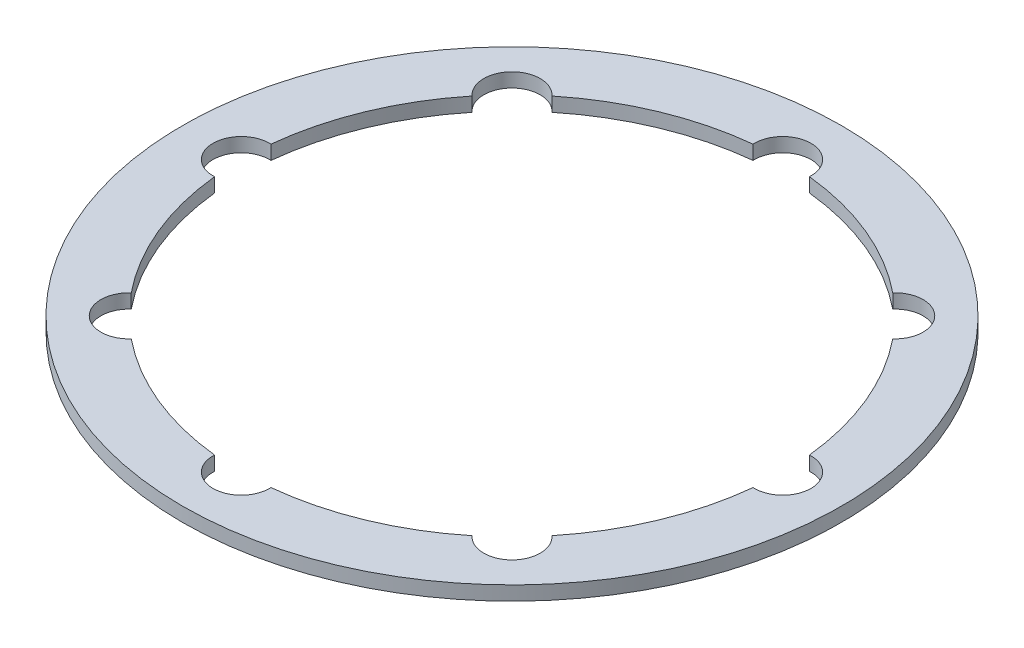
ISO-10303-21;
HEADER;
FILE_DESCRIPTION(('STEP AP214'),'2;1');
FILE_NAME('part.step','',(''),(''),'','','');
FILE_SCHEMA(('AUTOMOTIVE_DESIGN { 1 0 10303 214 1 1 1 1 }'));
ENDSEC;
DATA;
#1=APPLICATION_CONTEXT('core data for automotive mechanical design processes');
#2=APPLICATION_PROTOCOL_DEFINITION('international standard','automotive_design',2000,#1);
#3=PRODUCT_CONTEXT('',#1,'mechanical');
#4=PRODUCT('Part','Part','',(#3));
#5=PRODUCT_RELATED_PRODUCT_CATEGORY('part','',(#4));
#6=PRODUCT_DEFINITION_FORMATION('','',#4);
#7=PRODUCT_DEFINITION_CONTEXT('part definition',#1,'design');
#8=PRODUCT_DEFINITION('design','',#6,#7);
#9=PRODUCT_DEFINITION_SHAPE('','',#8);
#10=(LENGTH_UNIT() NAMED_UNIT(*) SI_UNIT(.MILLI.,.METRE.));
#11=(NAMED_UNIT(*) PLANE_ANGLE_UNIT() SI_UNIT($,.RADIAN.));
#12=(NAMED_UNIT(*) SI_UNIT($,.STERADIAN.) SOLID_ANGLE_UNIT());
#13=UNCERTAINTY_MEASURE_WITH_UNIT(LENGTH_MEASURE(1.E-05),#10,'distance_accuracy_value','');
#14=(GEOMETRIC_REPRESENTATION_CONTEXT(3) GLOBAL_UNCERTAINTY_ASSIGNED_CONTEXT((#13)) GLOBAL_UNIT_ASSIGNED_CONTEXT((#10,
#11,#12)) REPRESENTATION_CONTEXT('',''));
#15=CARTESIAN_POINT('',(0.,0.,0.));
#16=DIRECTION('',(0.,0.,1.));
#17=DIRECTION('',(1.,0.,0.));
#18=AXIS2_PLACEMENT_3D('',#15,#16,#17);
#19=CARTESIAN_POINT('',(0.,3.,0.));
#20=DIRECTION('',(0.,1.,0.));
#21=DIRECTION('',(0.,0.,1.));
#22=AXIS2_PLACEMENT_3D('',#19,#20,#21);
#23=PLANE('',#22);
#24=CARTESIAN_POINT('',(0.,3.,0.));
#25=DIRECTION('',(0.,1.,0.));
#26=DIRECTION('',(0.,0.,1.));
#27=AXIS2_PLACEMENT_3D('',#24,#25,#26);
#28=CIRCLE('',#27,70.);
#29=CARTESIAN_POINT('',(0.,3.,70.));
#30=VERTEX_POINT('',#29);
#31=EDGE_CURVE('E11',#30,#30,#28,.T.);
#32=ORIENTED_EDGE('',*,*,#31,.T.);
#33=EDGE_LOOP('',(#32));
#34=FACE_BOUND('',#33,.T.);
#35=CARTESIAN_POINT('',(1.32902621308496E-12,3.,-57.4999999999966));
#36=DIRECTION('',(0.,1.,0.));
#37=DIRECTION('',(0.,0.,1.));
#38=AXIS2_PLACEMENT_3D('',#35,#36,#37);
#39=CIRCLE('',#38,5.99999999999979);
#40=CARTESIAN_POINT('',(5.99182808337604,3.,-57.186956521739));
#41=VERTEX_POINT('',#40);
#42=CARTESIAN_POINT('',(-5.99182808337409,3.,-57.1869565217392));
#43=VERTEX_POINT('',#42);
#44=EDGE_CURVE('E162',#41,#43,#39,.T.);
#45=ORIENTED_EDGE('',*,*,#44,.F.);
#46=CARTESIAN_POINT('',(0.,3.,0.));
#47=DIRECTION('',(0.,1.,0.));
#48=DIRECTION('',(0.,0.,1.));
#49=AXIS2_PLACEMENT_3D('',#46,#47,#48);
#50=CIRCLE('',#49,57.5);
#51=CARTESIAN_POINT('',(36.2004224824845,3.,-44.6741470213996));
#52=VERTEX_POINT('',#51);
#53=EDGE_CURVE('E155',#52,#41,#50,.T.);
#54=ORIENTED_EDGE('',*,*,#53,.F.);
#55=CARTESIAN_POINT('',(40.6586399182254,3.,-40.658639918224));
#56=DIRECTION('',(0.,1.,0.));
#57=DIRECTION('',(0.,0.,1.));
#58=AXIS2_PLACEMENT_3D('',#55,#56,#57);
#59=CIRCLE('',#58,5.99999999999984);
#60=CARTESIAN_POINT('',(44.6741470214009,3.,-36.200422482483));
#61=VERTEX_POINT('',#60);
#62=EDGE_CURVE('E205',#61,#52,#59,.T.);
#63=ORIENTED_EDGE('',*,*,#62,.F.);
#64=CARTESIAN_POINT('',(0.,3.,0.));
#65=DIRECTION('',(0.,1.,0.));
#66=DIRECTION('',(0.,0.,1.));
#67=AXIS2_PLACEMENT_3D('',#64,#65,#66);
#68=CIRCLE('',#67,57.5);
#69=CARTESIAN_POINT('',(57.1869565217391,3.,-5.99182808337472));
#70=VERTEX_POINT('',#69);
#71=EDGE_CURVE('E196',#70,#61,#68,.T.);
#72=ORIENTED_EDGE('',*,*,#71,.F.);
#73=CARTESIAN_POINT('',(57.5,3.,0.));
#74=DIRECTION('',(0.,1.,0.));
#75=DIRECTION('',(0.,0.,1.));
#76=AXIS2_PLACEMENT_3D('',#73,#74,#75);
#77=CIRCLE('',#76,5.99999999999996);
#78=CARTESIAN_POINT('',(57.1869565217391,3.,5.99182808337471));
#79=VERTEX_POINT('',#78);
#80=EDGE_CURVE('E197',#79,#70,#77,.T.);
#81=ORIENTED_EDGE('',*,*,#80,.F.);
#82=CARTESIAN_POINT('',(0.,3.,0.));
#83=DIRECTION('',(0.,1.,0.));
#84=DIRECTION('',(0.,0.,1.));
#85=AXIS2_PLACEMENT_3D('',#82,#83,#84);
#86=CIRCLE('',#85,57.5);
#87=CARTESIAN_POINT('',(44.6741470214012,3.,36.2004224824826));
#88=VERTEX_POINT('',#87);
#89=EDGE_CURVE('E198',#88,#79,#86,.T.);
#90=ORIENTED_EDGE('',*,*,#89,.F.);
#91=CARTESIAN_POINT('',(40.658639918229,3.,40.6586399182255));
#92=DIRECTION('',(0.,1.,0.));
#93=DIRECTION('',(0.,0.,1.));
#94=AXIS2_PLACEMENT_3D('',#91,#92,#93);
#95=CIRCLE('',#94,6.00000000000006);
#96=CARTESIAN_POINT('',(36.2004224824856,3.,44.6741470213987));
#97=VERTEX_POINT('',#96);
#98=EDGE_CURVE('E193',#97,#88,#95,.T.);
#99=ORIENTED_EDGE('',*,*,#98,.F.);
#100=CARTESIAN_POINT('',(0.,3.,0.));
#101=DIRECTION('',(0.,1.,0.));
#102=DIRECTION('',(0.,0.,1.));
#103=AXIS2_PLACEMENT_3D('',#100,#101,#102);
#104=CIRCLE('',#103,57.5);
#105=CARTESIAN_POINT('',(5.99182808337971,3.,57.1869565217386));
#106=VERTEX_POINT('',#105);
#107=EDGE_CURVE('E195',#106,#97,#104,.T.);
#108=ORIENTED_EDGE('',*,*,#107,.F.);
#109=CARTESIAN_POINT('',(3.37544102857295E-12,3.,57.4999999999987));
#110=DIRECTION('',(0.,1.,0.));
#111=DIRECTION('',(0.,0.,1.));
#112=AXIS2_PLACEMENT_3D('',#109,#110,#111);
#113=CIRCLE('',#112,6.00000000000077);
#114=CARTESIAN_POINT('',(-5.99182808337223,3.,57.1869565217394));
#115=VERTEX_POINT('',#114);
#116=EDGE_CURVE('E188',#115,#106,#113,.T.);
#117=ORIENTED_EDGE('',*,*,#116,.F.);
#118=CARTESIAN_POINT('',(0.,3.,0.));
#119=DIRECTION('',(0.,1.,0.));
#120=DIRECTION('',(0.,0.,1.));
#121=AXIS2_PLACEMENT_3D('',#118,#119,#120);
#122=CIRCLE('',#121,57.5);
#123=CARTESIAN_POINT('',(-36.2004224824809,3.,44.6741470214025));
#124=VERTEX_POINT('',#123);
#125=EDGE_CURVE('E189',#124,#115,#122,.T.);
#126=ORIENTED_EDGE('',*,*,#125,.F.);
#127=CARTESIAN_POINT('',(-40.6586399182217,3.,40.6586399182266));
#128=DIRECTION('',(0.,1.,0.));
#129=DIRECTION('',(0.,0.,1.));
#130=AXIS2_PLACEMENT_3D('',#127,#128,#129);
#131=CIRCLE('',#130,6.);
#132=CARTESIAN_POINT('',(-44.6741470213982,3.,36.2004224824862));
#133=VERTEX_POINT('',#132);
#134=EDGE_CURVE('E187',#133,#124,#131,.T.);
#135=ORIENTED_EDGE('',*,*,#134,.F.);
#136=CARTESIAN_POINT('',(0.,3.,0.));
#137=DIRECTION('',(0.,1.,0.));
#138=DIRECTION('',(0.,0.,1.));
#139=AXIS2_PLACEMENT_3D('',#136,#137,#138);
#140=CIRCLE('',#139,57.5);
#141=CARTESIAN_POINT('',(-57.1869565217389,3.,5.99182808337698));
#142=VERTEX_POINT('',#141);
#143=EDGE_CURVE('E183',#142,#133,#140,.T.);
#144=ORIENTED_EDGE('',*,*,#143,.F.);
#145=CARTESIAN_POINT('',(-57.4999999999953,3.,2.0323313772978E-12));
#146=DIRECTION('',(0.,1.,0.));
#147=DIRECTION('',(0.,0.,1.));
#148=AXIS2_PLACEMENT_3D('',#145,#146,#147);
#149=CIRCLE('',#148,6.);
#150=CARTESIAN_POINT('',(-57.1869565217393,3.,-5.99182808337297));
#151=VERTEX_POINT('',#150);
#152=EDGE_CURVE('E185',#151,#142,#149,.T.);
#153=ORIENTED_EDGE('',*,*,#152,.F.);
#154=CARTESIAN_POINT('',(0.,3.,0.));
#155=DIRECTION('',(0.,1.,0.));
#156=DIRECTION('',(0.,0.,1.));
#157=AXIS2_PLACEMENT_3D('',#154,#155,#156);
#158=CIRCLE('',#157,57.5);
#159=CARTESIAN_POINT('',(-44.6741470214005,3.,-36.2004224824835));
#160=VERTEX_POINT('',#159);
#161=EDGE_CURVE('E179',#160,#151,#158,.T.);
#162=ORIENTED_EDGE('',*,*,#161,.F.);
#163=CARTESIAN_POINT('',(-40.6586399182232,3.,-40.6586399182231));
#164=DIRECTION('',(0.,1.,0.));
#165=DIRECTION('',(0.,0.,1.));
#166=AXIS2_PLACEMENT_3D('',#163,#164,#165);
#167=CIRCLE('',#166,6.);
#168=CARTESIAN_POINT('',(-36.2004224824836,3.,-44.6741470214004));
#169=VERTEX_POINT('',#168);
#170=EDGE_CURVE('E176',#169,#160,#167,.T.);
#171=ORIENTED_EDGE('',*,*,#170,.F.);
#172=CARTESIAN_POINT('',(0.,3.,0.));
#173=DIRECTION('',(0.,1.,0.));
#174=DIRECTION('',(0.,0.,1.));
#175=AXIS2_PLACEMENT_3D('',#172,#173,#174);
#176=CIRCLE('',#175,57.5);
#177=EDGE_CURVE('E172',#43,#169,#176,.T.);
#178=ORIENTED_EDGE('',*,*,#177,.F.);
#179=EDGE_LOOP('',(#45,#54,#63,#72,#81,#90,#99,#108,#117,#126,#135,#144,#153,#162,#171,#178));
#180=FACE_BOUND('',#179,.T.);
#181=ADVANCED_FACE('F41',(#34,#180),#23,.T.);
#182=CARTESIAN_POINT('',(0.,0.,0.));
#183=DIRECTION('',(0.,1.,0.));
#184=DIRECTION('',(0.,0.,1.));
#185=AXIS2_PLACEMENT_3D('',#182,#183,#184);
#186=PLANE('',#185);
#187=CARTESIAN_POINT('',(0.,0.,0.));
#188=DIRECTION('',(0.,1.,0.));
#189=DIRECTION('',(0.,0.,1.));
#190=AXIS2_PLACEMENT_3D('',#187,#188,#189);
#191=CIRCLE('',#190,70.);
#192=CARTESIAN_POINT('',(0.,0.,70.));
#193=VERTEX_POINT('',#192);
#194=EDGE_CURVE('E44',#193,#193,#191,.T.);
#195=ORIENTED_EDGE('',*,*,#194,.F.);
#196=EDGE_LOOP('',(#195));
#197=FACE_BOUND('',#196,.T.);
#198=CARTESIAN_POINT('',(0.,0.,0.));
#199=DIRECTION('',(0.,1.,0.));
#200=DIRECTION('',(0.,0.,1.));
#201=AXIS2_PLACEMENT_3D('',#198,#199,#200);
#202=CIRCLE('',#201,57.5);
#203=CARTESIAN_POINT('',(36.2004224824845,0.,-44.6741470213996));
#204=VERTEX_POINT('',#203);
#205=CARTESIAN_POINT('',(5.99182808337604,0.,-57.186956521739));
#206=VERTEX_POINT('',#205);
#207=EDGE_CURVE('E63',#204,#206,#202,.T.);
#208=ORIENTED_EDGE('',*,*,#207,.T.);
#209=CARTESIAN_POINT('',(1.32902621308496E-12,0.,-57.4999999999966));
#210=DIRECTION('',(0.,1.,0.));
#211=DIRECTION('',(0.,0.,1.));
#212=AXIS2_PLACEMENT_3D('',#209,#210,#211);
#213=CIRCLE('',#212,5.99999999999979);
#214=CARTESIAN_POINT('',(-5.99182808337409,0.,-57.1869565217392));
#215=VERTEX_POINT('',#214);
#216=EDGE_CURVE('E169',#206,#215,#213,.T.);
#217=ORIENTED_EDGE('',*,*,#216,.T.);
#218=CARTESIAN_POINT('',(0.,0.,0.));
#219=DIRECTION('',(0.,1.,0.));
#220=DIRECTION('',(0.,0.,1.));
#221=AXIS2_PLACEMENT_3D('',#218,#219,#220);
#222=CIRCLE('',#221,57.5);
#223=CARTESIAN_POINT('',(-36.2004224824836,0.,-44.6741470214004));
#224=VERTEX_POINT('',#223);
#225=EDGE_CURVE('E207',#215,#224,#222,.T.);
#226=ORIENTED_EDGE('',*,*,#225,.T.);
#227=CARTESIAN_POINT('',(-40.6586399182232,0.,-40.6586399182231));
#228=DIRECTION('',(0.,1.,0.));
#229=DIRECTION('',(0.,0.,1.));
#230=AXIS2_PLACEMENT_3D('',#227,#228,#229);
#231=CIRCLE('',#230,6.);
#232=CARTESIAN_POINT('',(-44.6741470214005,0.,-36.2004224824835));
#233=VERTEX_POINT('',#232);
#234=EDGE_CURVE('E209',#224,#233,#231,.T.);
#235=ORIENTED_EDGE('',*,*,#234,.T.);
#236=CARTESIAN_POINT('',(0.,0.,0.));
#237=DIRECTION('',(0.,1.,0.));
#238=DIRECTION('',(0.,0.,1.));
#239=AXIS2_PLACEMENT_3D('',#236,#237,#238);
#240=CIRCLE('',#239,57.5);
#241=CARTESIAN_POINT('',(-57.1869565217393,0.,-5.99182808337297));
#242=VERTEX_POINT('',#241);
#243=EDGE_CURVE('E215',#233,#242,#240,.T.);
#244=ORIENTED_EDGE('',*,*,#243,.T.);
#245=CARTESIAN_POINT('',(-57.4999999999953,0.,2.0323313772978E-12));
#246=DIRECTION('',(0.,1.,0.));
#247=DIRECTION('',(0.,0.,1.));
#248=AXIS2_PLACEMENT_3D('',#245,#246,#247);
#249=CIRCLE('',#248,6.);
#250=CARTESIAN_POINT('',(-57.1869565217389,0.,5.99182808337698));
#251=VERTEX_POINT('',#250);
#252=EDGE_CURVE('E214',#242,#251,#249,.T.);
#253=ORIENTED_EDGE('',*,*,#252,.T.);
#254=CARTESIAN_POINT('',(0.,0.,0.));
#255=DIRECTION('',(0.,1.,0.));
#256=DIRECTION('',(0.,0.,1.));
#257=AXIS2_PLACEMENT_3D('',#254,#255,#256);
#258=CIRCLE('',#257,57.5);
#259=CARTESIAN_POINT('',(-44.6741470213982,0.,36.2004224824862));
#260=VERTEX_POINT('',#259);
#261=EDGE_CURVE('E217',#251,#260,#258,.T.);
#262=ORIENTED_EDGE('',*,*,#261,.T.);
#263=CARTESIAN_POINT('',(-40.6586399182217,0.,40.6586399182266));
#264=DIRECTION('',(0.,1.,0.));
#265=DIRECTION('',(0.,0.,1.));
#266=AXIS2_PLACEMENT_3D('',#263,#264,#265);
#267=CIRCLE('',#266,6.);
#268=CARTESIAN_POINT('',(-36.2004224824809,0.,44.6741470214025));
#269=VERTEX_POINT('',#268);
#270=EDGE_CURVE('E221',#260,#269,#267,.T.);
#271=ORIENTED_EDGE('',*,*,#270,.T.);
#272=CARTESIAN_POINT('',(0.,0.,0.));
#273=DIRECTION('',(0.,1.,0.));
#274=DIRECTION('',(0.,0.,1.));
#275=AXIS2_PLACEMENT_3D('',#272,#273,#274);
#276=CIRCLE('',#275,57.5);
#277=CARTESIAN_POINT('',(-5.99182808337223,0.,57.1869565217394));
#278=VERTEX_POINT('',#277);
#279=EDGE_CURVE('E223',#269,#278,#276,.T.);
#280=ORIENTED_EDGE('',*,*,#279,.T.);
#281=CARTESIAN_POINT('',(3.37544102857295E-12,0.,57.4999999999987));
#282=DIRECTION('',(0.,1.,0.));
#283=DIRECTION('',(0.,0.,1.));
#284=AXIS2_PLACEMENT_3D('',#281,#282,#283);
#285=CIRCLE('',#284,6.00000000000077);
#286=CARTESIAN_POINT('',(5.99182808337971,0.,57.1869565217386));
#287=VERTEX_POINT('',#286);
#288=EDGE_CURVE('E227',#278,#287,#285,.T.);
#289=ORIENTED_EDGE('',*,*,#288,.T.);
#290=CARTESIAN_POINT('',(0.,0.,0.));
#291=DIRECTION('',(0.,1.,0.));
#292=DIRECTION('',(0.,0.,1.));
#293=AXIS2_PLACEMENT_3D('',#290,#291,#292);
#294=CIRCLE('',#293,57.5);
#295=CARTESIAN_POINT('',(36.2004224824856,0.,44.6741470213987));
#296=VERTEX_POINT('',#295);
#297=EDGE_CURVE('E229',#287,#296,#294,.T.);
#298=ORIENTED_EDGE('',*,*,#297,.T.);
#299=CARTESIAN_POINT('',(40.658639918229,0.,40.6586399182255));
#300=DIRECTION('',(0.,1.,0.));
#301=DIRECTION('',(0.,0.,1.));
#302=AXIS2_PLACEMENT_3D('',#299,#300,#301);
#303=CIRCLE('',#302,6.00000000000006);
#304=CARTESIAN_POINT('',(44.6741470214012,0.,36.2004224824826));
#305=VERTEX_POINT('',#304);
#306=EDGE_CURVE('E231',#296,#305,#303,.T.);
#307=ORIENTED_EDGE('',*,*,#306,.T.);
#308=CARTESIAN_POINT('',(0.,0.,0.));
#309=DIRECTION('',(0.,1.,0.));
#310=DIRECTION('',(0.,0.,1.));
#311=AXIS2_PLACEMENT_3D('',#308,#309,#310);
#312=CIRCLE('',#311,57.5);
#313=CARTESIAN_POINT('',(57.1869565217391,0.,5.99182808337471));
#314=VERTEX_POINT('',#313);
#315=EDGE_CURVE('E236',#305,#314,#312,.T.);
#316=ORIENTED_EDGE('',*,*,#315,.T.);
#317=CARTESIAN_POINT('',(57.5,0.,0.));
#318=DIRECTION('',(0.,1.,0.));
#319=DIRECTION('',(0.,0.,1.));
#320=AXIS2_PLACEMENT_3D('',#317,#318,#319);
#321=CIRCLE('',#320,5.99999999999996);
#322=CARTESIAN_POINT('',(57.1869565217391,0.,-5.99182808337472));
#323=VERTEX_POINT('',#322);
#324=EDGE_CURVE('E237',#314,#323,#321,.T.);
#325=ORIENTED_EDGE('',*,*,#324,.T.);
#326=CARTESIAN_POINT('',(0.,0.,0.));
#327=DIRECTION('',(0.,1.,0.));
#328=DIRECTION('',(0.,0.,1.));
#329=AXIS2_PLACEMENT_3D('',#326,#327,#328);
#330=CIRCLE('',#329,57.5);
#331=CARTESIAN_POINT('',(44.6741470214009,0.,-36.200422482483));
#332=VERTEX_POINT('',#331);
#333=EDGE_CURVE('E245',#323,#332,#330,.T.);
#334=ORIENTED_EDGE('',*,*,#333,.T.);
#335=CARTESIAN_POINT('',(40.6586399182254,0.,-40.658639918224));
#336=DIRECTION('',(0.,1.,0.));
#337=DIRECTION('',(0.,0.,1.));
#338=AXIS2_PLACEMENT_3D('',#335,#336,#337);
#339=CIRCLE('',#338,5.99999999999984);
#340=EDGE_CURVE('E161',#332,#204,#339,.T.);
#341=ORIENTED_EDGE('',*,*,#340,.T.);
#342=EDGE_LOOP('',(#208,#217,#226,#235,#244,#253,#262,#271,#280,#289,#298,#307,#316,#325,#334,#341));
#343=FACE_BOUND('',#342,.T.);
#344=ADVANCED_FACE('F278',(#197,#343),#186,.F.);
#345=CARTESIAN_POINT('',(0.,3.,0.));
#346=DIRECTION('',(0.,-1.,0.));
#347=DIRECTION('',(0.,0.,-1.));
#348=AXIS2_PLACEMENT_3D('',#345,#346,#347);
#349=CYLINDRICAL_SURFACE('',#348,70.);
#350=ORIENTED_EDGE('',*,*,#31,.F.);
#351=EDGE_LOOP('',(#350));
#352=FACE_BOUND('',#351,.T.);
#353=ORIENTED_EDGE('',*,*,#194,.T.);
#354=EDGE_LOOP('',(#353));
#355=FACE_BOUND('',#354,.T.);
#356=ADVANCED_FACE('F43',(#352,#355),#349,.T.);
#357=CARTESIAN_POINT('',(0.,3.,0.));
#358=DIRECTION('',(0.,-1.,0.));
#359=DIRECTION('',(0.,0.,-1.));
#360=AXIS2_PLACEMENT_3D('',#357,#358,#359);
#361=CYLINDRICAL_SURFACE('',#360,57.5);
#362=ORIENTED_EDGE('',*,*,#207,.F.);
#363=DIRECTION('',(0.,-1.,0.));
#364=VECTOR('',#363,1.);
#365=CARTESIAN_POINT('',(36.2004224824845,3.,-44.6741470213996));
#366=LINE('',#365,#364);
#367=EDGE_CURVE('E157',#52,#204,#366,.T.);
#368=ORIENTED_EDGE('',*,*,#367,.F.);
#369=ORIENTED_EDGE('',*,*,#53,.T.);
#370=DIRECTION('',(0.,-1.,0.));
#371=VECTOR('',#370,1.);
#372=CARTESIAN_POINT('',(5.99182808337604,3.,-57.186956521739));
#373=LINE('',#372,#371);
#374=EDGE_CURVE('E160',#41,#206,#373,.T.);
#375=ORIENTED_EDGE('',*,*,#374,.T.);
#376=EDGE_LOOP('',(#362,#368,#369,#375));
#377=FACE_BOUND('',#376,.T.);
#378=ADVANCED_FACE('F156',(#377),#361,.F.);
#379=CARTESIAN_POINT('',(1.32902621308496E-12,3.,-57.4999999999966));
#380=DIRECTION('',(0.,-1.,0.));
#381=DIRECTION('',(0.,0.,-1.));
#382=AXIS2_PLACEMENT_3D('',#379,#380,#381);
#383=CYLINDRICAL_SURFACE('',#382,5.99999999999979);
#384=ORIENTED_EDGE('',*,*,#216,.F.);
#385=ORIENTED_EDGE('',*,*,#374,.F.);
#386=ORIENTED_EDGE('',*,*,#44,.T.);
#387=DIRECTION('',(0.,-1.,0.));
#388=VECTOR('',#387,1.);
#389=CARTESIAN_POINT('',(-5.99182808337409,3.,-57.1869565217392));
#390=LINE('',#389,#388);
#391=EDGE_CURVE('E167',#43,#215,#390,.T.);
#392=ORIENTED_EDGE('',*,*,#391,.T.);
#393=EDGE_LOOP('',(#384,#385,#386,#392));
#394=FACE_BOUND('',#393,.T.);
#395=ADVANCED_FACE('F168',(#394),#383,.F.);
#396=CARTESIAN_POINT('',(0.,3.,0.));
#397=DIRECTION('',(0.,-1.,0.));
#398=DIRECTION('',(0.,0.,-1.));
#399=AXIS2_PLACEMENT_3D('',#396,#397,#398);
#400=CYLINDRICAL_SURFACE('',#399,57.5);
#401=ORIENTED_EDGE('',*,*,#225,.F.);
#402=ORIENTED_EDGE('',*,*,#391,.F.);
#403=ORIENTED_EDGE('',*,*,#177,.T.);
#404=DIRECTION('',(0.,-1.,0.));
#405=VECTOR('',#404,1.);
#406=CARTESIAN_POINT('',(-36.2004224824836,3.,-44.6741470214004));
#407=LINE('',#406,#405);
#408=EDGE_CURVE('E272',#169,#224,#407,.T.);
#409=ORIENTED_EDGE('',*,*,#408,.T.);
#410=EDGE_LOOP('',(#401,#402,#403,#409));
#411=FACE_BOUND('',#410,.T.);
#412=ADVANCED_FACE('F273',(#411),#400,.F.);
#413=CARTESIAN_POINT('',(-40.6586399182232,3.,-40.6586399182231));
#414=DIRECTION('',(0.,-1.,0.));
#415=DIRECTION('',(0.,0.,-1.));
#416=AXIS2_PLACEMENT_3D('',#413,#414,#415);
#417=CYLINDRICAL_SURFACE('',#416,6.);
#418=ORIENTED_EDGE('',*,*,#234,.F.);
#419=ORIENTED_EDGE('',*,*,#408,.F.);
#420=ORIENTED_EDGE('',*,*,#170,.T.);
#421=DIRECTION('',(0.,-1.,0.));
#422=VECTOR('',#421,1.);
#423=CARTESIAN_POINT('',(-44.6741470214005,3.,-36.2004224824835));
#424=LINE('',#423,#422);
#425=EDGE_CURVE('E268',#160,#233,#424,.T.);
#426=ORIENTED_EDGE('',*,*,#425,.T.);
#427=EDGE_LOOP('',(#418,#419,#420,#426));
#428=FACE_BOUND('',#427,.T.);
#429=ADVANCED_FACE('F340',(#428),#417,.F.);
#430=CARTESIAN_POINT('',(0.,3.,0.));
#431=DIRECTION('',(0.,-1.,0.));
#432=DIRECTION('',(0.,0.,-1.));
#433=AXIS2_PLACEMENT_3D('',#430,#431,#432);
#434=CYLINDRICAL_SURFACE('',#433,57.5);
#435=ORIENTED_EDGE('',*,*,#243,.F.);
#436=ORIENTED_EDGE('',*,*,#425,.F.);
#437=ORIENTED_EDGE('',*,*,#161,.T.);
#438=DIRECTION('',(0.,-1.,0.));
#439=VECTOR('',#438,1.);
#440=CARTESIAN_POINT('',(-57.1869565217393,3.,-5.99182808337297));
#441=LINE('',#440,#439);
#442=EDGE_CURVE('E270',#151,#242,#441,.T.);
#443=ORIENTED_EDGE('',*,*,#442,.T.);
#444=EDGE_LOOP('',(#435,#436,#437,#443));
#445=FACE_BOUND('',#444,.T.);
#446=ADVANCED_FACE('F333',(#445),#434,.F.);
#447=CARTESIAN_POINT('',(-57.4999999999953,3.,2.0323313772978E-12));
#448=DIRECTION('',(0.,-1.,0.));
#449=DIRECTION('',(0.,0.,-1.));
#450=AXIS2_PLACEMENT_3D('',#447,#448,#449);
#451=CYLINDRICAL_SURFACE('',#450,6.);
#452=ORIENTED_EDGE('',*,*,#252,.F.);
#453=ORIENTED_EDGE('',*,*,#442,.F.);
#454=ORIENTED_EDGE('',*,*,#152,.T.);
#455=DIRECTION('',(0.,-1.,0.));
#456=VECTOR('',#455,1.);
#457=CARTESIAN_POINT('',(-57.1869565217389,3.,5.99182808337698));
#458=LINE('',#457,#456);
#459=EDGE_CURVE('E261',#142,#251,#458,.T.);
#460=ORIENTED_EDGE('',*,*,#459,.T.);
#461=EDGE_LOOP('',(#452,#453,#454,#460));
#462=FACE_BOUND('',#461,.T.);
#463=ADVANCED_FACE('F331',(#462),#451,.F.);
#464=CARTESIAN_POINT('',(0.,3.,0.));
#465=DIRECTION('',(0.,-1.,0.));
#466=DIRECTION('',(0.,0.,-1.));
#467=AXIS2_PLACEMENT_3D('',#464,#465,#466);
#468=CYLINDRICAL_SURFACE('',#467,57.5);
#469=ORIENTED_EDGE('',*,*,#261,.F.);
#470=ORIENTED_EDGE('',*,*,#459,.F.);
#471=ORIENTED_EDGE('',*,*,#143,.T.);
#472=DIRECTION('',(0.,-1.,0.));
#473=VECTOR('',#472,1.);
#474=CARTESIAN_POINT('',(-44.6741470213982,3.,36.2004224824862));
#475=LINE('',#474,#473);
#476=EDGE_CURVE('E262',#133,#260,#475,.T.);
#477=ORIENTED_EDGE('',*,*,#476,.T.);
#478=EDGE_LOOP('',(#469,#470,#471,#477));
#479=FACE_BOUND('',#478,.T.);
#480=ADVANCED_FACE('F323',(#479),#468,.F.);
#481=CARTESIAN_POINT('',(-40.6586399182217,3.,40.6586399182266));
#482=DIRECTION('',(0.,-1.,0.));
#483=DIRECTION('',(0.,0.,-1.));
#484=AXIS2_PLACEMENT_3D('',#481,#482,#483);
#485=CYLINDRICAL_SURFACE('',#484,6.);
#486=ORIENTED_EDGE('',*,*,#270,.F.);
#487=ORIENTED_EDGE('',*,*,#476,.F.);
#488=ORIENTED_EDGE('',*,*,#134,.T.);
#489=DIRECTION('',(0.,-1.,0.));
#490=VECTOR('',#489,1.);
#491=CARTESIAN_POINT('',(-36.2004224824809,3.,44.6741470214025));
#492=LINE('',#491,#490);
#493=EDGE_CURVE('E263',#124,#269,#492,.T.);
#494=ORIENTED_EDGE('',*,*,#493,.T.);
#495=EDGE_LOOP('',(#486,#487,#488,#494));
#496=FACE_BOUND('',#495,.T.);
#497=ADVANCED_FACE('F318',(#496),#485,.F.);
#498=CARTESIAN_POINT('',(0.,3.,0.));
#499=DIRECTION('',(0.,-1.,0.));
#500=DIRECTION('',(0.,0.,-1.));
#501=AXIS2_PLACEMENT_3D('',#498,#499,#500);
#502=CYLINDRICAL_SURFACE('',#501,57.5);
#503=ORIENTED_EDGE('',*,*,#279,.F.);
#504=ORIENTED_EDGE('',*,*,#493,.F.);
#505=ORIENTED_EDGE('',*,*,#125,.T.);
#506=DIRECTION('',(0.,-1.,0.));
#507=VECTOR('',#506,1.);
#508=CARTESIAN_POINT('',(-5.99182808337223,3.,57.1869565217394));
#509=LINE('',#508,#507);
#510=EDGE_CURVE('E258',#115,#278,#509,.T.);
#511=ORIENTED_EDGE('',*,*,#510,.T.);
#512=EDGE_LOOP('',(#503,#504,#505,#511));
#513=FACE_BOUND('',#512,.T.);
#514=ADVANCED_FACE('F320',(#513),#502,.F.);
#515=CARTESIAN_POINT('',(3.37544102857295E-12,3.,57.4999999999987));
#516=DIRECTION('',(0.,-1.,0.));
#517=DIRECTION('',(0.,0.,-1.));
#518=AXIS2_PLACEMENT_3D('',#515,#516,#517);
#519=CYLINDRICAL_SURFACE('',#518,6.00000000000077);
#520=ORIENTED_EDGE('',*,*,#288,.F.);
#521=ORIENTED_EDGE('',*,*,#510,.F.);
#522=ORIENTED_EDGE('',*,*,#116,.T.);
#523=DIRECTION('',(0.,-1.,0.));
#524=VECTOR('',#523,1.);
#525=CARTESIAN_POINT('',(5.99182808337971,3.,57.1869565217386));
#526=LINE('',#525,#524);
#527=EDGE_CURVE('E260',#106,#287,#526,.T.);
#528=ORIENTED_EDGE('',*,*,#527,.T.);
#529=EDGE_LOOP('',(#520,#521,#522,#528));
#530=FACE_BOUND('',#529,.T.);
#531=ADVANCED_FACE('F307',(#530),#519,.F.);
#532=CARTESIAN_POINT('',(0.,3.,0.));
#533=DIRECTION('',(0.,-1.,0.));
#534=DIRECTION('',(0.,0.,-1.));
#535=AXIS2_PLACEMENT_3D('',#532,#533,#534);
#536=CYLINDRICAL_SURFACE('',#535,57.5);
#537=ORIENTED_EDGE('',*,*,#297,.F.);
#538=ORIENTED_EDGE('',*,*,#527,.F.);
#539=ORIENTED_EDGE('',*,*,#107,.T.);
#540=DIRECTION('',(0.,-1.,0.));
#541=VECTOR('',#540,1.);
#542=CARTESIAN_POINT('',(36.2004224824856,3.,44.6741470213987));
#543=LINE('',#542,#541);
#544=EDGE_CURVE('E253',#97,#296,#543,.T.);
#545=ORIENTED_EDGE('',*,*,#544,.T.);
#546=EDGE_LOOP('',(#537,#538,#539,#545));
#547=FACE_BOUND('',#546,.T.);
#548=ADVANCED_FACE('F304',(#547),#536,.F.);
#549=CARTESIAN_POINT('',(40.658639918229,3.,40.6586399182255));
#550=DIRECTION('',(0.,-1.,0.));
#551=DIRECTION('',(0.,0.,-1.));
#552=AXIS2_PLACEMENT_3D('',#549,#550,#551);
#553=CYLINDRICAL_SURFACE('',#552,6.00000000000006);
#554=ORIENTED_EDGE('',*,*,#306,.F.);
#555=ORIENTED_EDGE('',*,*,#544,.F.);
#556=ORIENTED_EDGE('',*,*,#98,.T.);
#557=DIRECTION('',(0.,-1.,0.));
#558=VECTOR('',#557,1.);
#559=CARTESIAN_POINT('',(44.6741470214012,3.,36.2004224824826));
#560=LINE('',#559,#558);
#561=EDGE_CURVE('E254',#88,#305,#560,.T.);
#562=ORIENTED_EDGE('',*,*,#561,.T.);
#563=EDGE_LOOP('',(#554,#555,#556,#562));
#564=FACE_BOUND('',#563,.T.);
#565=ADVANCED_FACE('F305',(#564),#553,.F.);
#566=CARTESIAN_POINT('',(0.,3.,0.));
#567=DIRECTION('',(0.,-1.,0.));
#568=DIRECTION('',(0.,0.,-1.));
#569=AXIS2_PLACEMENT_3D('',#566,#567,#568);
#570=CYLINDRICAL_SURFACE('',#569,57.5);
#571=ORIENTED_EDGE('',*,*,#315,.F.);
#572=ORIENTED_EDGE('',*,*,#561,.F.);
#573=ORIENTED_EDGE('',*,*,#89,.T.);
#574=DIRECTION('',(0.,-1.,0.));
#575=VECTOR('',#574,1.);
#576=CARTESIAN_POINT('',(57.1869565217391,3.,5.99182808337471));
#577=LINE('',#576,#575);
#578=EDGE_CURVE('E252',#79,#314,#577,.T.);
#579=ORIENTED_EDGE('',*,*,#578,.T.);
#580=EDGE_LOOP('',(#571,#572,#573,#579));
#581=FACE_BOUND('',#580,.T.);
#582=ADVANCED_FACE('F295',(#581),#570,.F.);
#583=CARTESIAN_POINT('',(57.5,3.,0.));
#584=DIRECTION('',(0.,-1.,0.));
#585=DIRECTION('',(0.,0.,-1.));
#586=AXIS2_PLACEMENT_3D('',#583,#584,#585);
#587=CYLINDRICAL_SURFACE('',#586,5.99999999999996);
#588=ORIENTED_EDGE('',*,*,#324,.F.);
#589=ORIENTED_EDGE('',*,*,#578,.F.);
#590=ORIENTED_EDGE('',*,*,#80,.T.);
#591=DIRECTION('',(0.,-1.,0.));
#592=VECTOR('',#591,1.);
#593=CARTESIAN_POINT('',(57.1869565217391,3.,-5.99182808337472));
#594=LINE('',#593,#592);
#595=EDGE_CURVE('E248',#70,#323,#594,.T.);
#596=ORIENTED_EDGE('',*,*,#595,.T.);
#597=EDGE_LOOP('',(#588,#589,#590,#596));
#598=FACE_BOUND('',#597,.T.);
#599=ADVANCED_FACE('F289',(#598),#587,.F.);
#600=CARTESIAN_POINT('',(0.,3.,0.));
#601=DIRECTION('',(0.,-1.,0.));
#602=DIRECTION('',(0.,0.,-1.));
#603=AXIS2_PLACEMENT_3D('',#600,#601,#602);
#604=CYLINDRICAL_SURFACE('',#603,57.5);
#605=ORIENTED_EDGE('',*,*,#333,.F.);
#606=ORIENTED_EDGE('',*,*,#595,.F.);
#607=ORIENTED_EDGE('',*,*,#71,.T.);
#608=DIRECTION('',(0.,-1.,0.));
#609=VECTOR('',#608,1.);
#610=CARTESIAN_POINT('',(44.6741470214009,3.,-36.200422482483));
#611=LINE('',#610,#609);
#612=EDGE_CURVE('E57',#61,#332,#611,.T.);
#613=ORIENTED_EDGE('',*,*,#612,.T.);
#614=EDGE_LOOP('',(#605,#606,#607,#613));
#615=FACE_BOUND('',#614,.T.);
#616=ADVANCED_FACE('F290',(#615),#604,.F.);
#617=CARTESIAN_POINT('',(40.6586399182254,3.,-40.658639918224));
#618=DIRECTION('',(0.,-1.,0.));
#619=DIRECTION('',(0.,0.,-1.));
#620=AXIS2_PLACEMENT_3D('',#617,#618,#619);
#621=CYLINDRICAL_SURFACE('',#620,5.99999999999984);
#622=ORIENTED_EDGE('',*,*,#340,.F.);
#623=ORIENTED_EDGE('',*,*,#612,.F.);
#624=ORIENTED_EDGE('',*,*,#62,.T.);
#625=ORIENTED_EDGE('',*,*,#367,.T.);
#626=EDGE_LOOP('',(#622,#623,#624,#625));
#627=FACE_BOUND('',#626,.T.);
#628=ADVANCED_FACE('F283',(#627),#621,.F.);
#629=CLOSED_SHELL('',(#181,#344,#356,#378,#395,#412,#429,#446,#463,#480,#497,#514,#531,#548,
#565,#582,#599,#616,#628));
#630=MANIFOLD_SOLID_BREP('B2',#629);
#631=ADVANCED_BREP_SHAPE_REPRESENTATION('',(#18,#630),#14);
#632=SHAPE_DEFINITION_REPRESENTATION(#9,#631);
ENDSEC;
END-ISO-10303-21;
